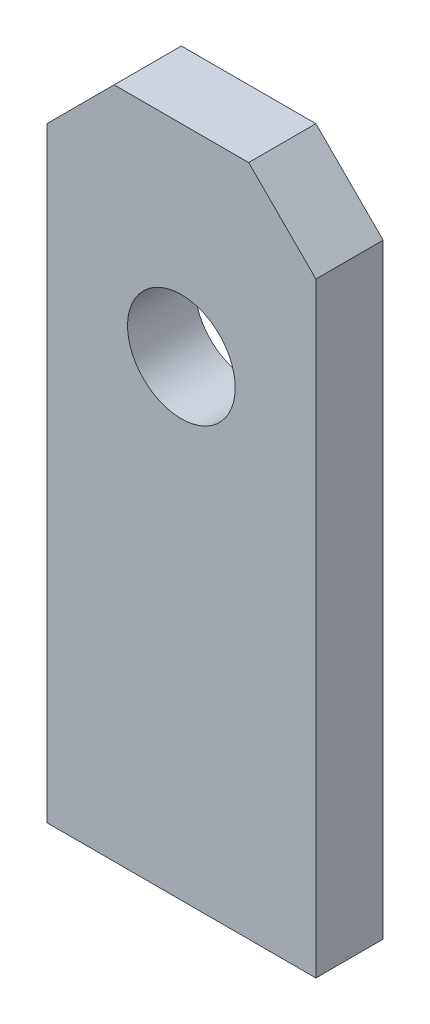
ISO-10303-21;
HEADER;
FILE_DESCRIPTION(('STEP AP214'),'2;1');
FILE_NAME('part.step','',(''),(''),'','','');
FILE_SCHEMA(('AUTOMOTIVE_DESIGN { 1 0 10303 214 1 1 1 1 }'));
ENDSEC;
DATA;
#1=APPLICATION_CONTEXT('core data for automotive mechanical design processes');
#2=APPLICATION_PROTOCOL_DEFINITION('international standard','automotive_design',2000,#1);
#3=PRODUCT_CONTEXT('',#1,'mechanical');
#4=PRODUCT('Part','Part','',(#3));
#5=PRODUCT_RELATED_PRODUCT_CATEGORY('part','',(#4));
#6=PRODUCT_DEFINITION_FORMATION('','',#4);
#7=PRODUCT_DEFINITION_CONTEXT('part definition',#1,'design');
#8=PRODUCT_DEFINITION('design','',#6,#7);
#9=PRODUCT_DEFINITION_SHAPE('','',#8);
#10=(LENGTH_UNIT() NAMED_UNIT(*) SI_UNIT(.MILLI.,.METRE.));
#11=(NAMED_UNIT(*) PLANE_ANGLE_UNIT() SI_UNIT($,.RADIAN.));
#12=(NAMED_UNIT(*) SI_UNIT($,.STERADIAN.) SOLID_ANGLE_UNIT());
#13=UNCERTAINTY_MEASURE_WITH_UNIT(LENGTH_MEASURE(1.E-05),#10,'distance_accuracy_value','');
#14=(GEOMETRIC_REPRESENTATION_CONTEXT(3) GLOBAL_UNCERTAINTY_ASSIGNED_CONTEXT((#13)) GLOBAL_UNIT_ASSIGNED_CONTEXT((#10,
#11,#12)) REPRESENTATION_CONTEXT('',''));
#15=CARTESIAN_POINT('',(0.,0.,0.));
#16=DIRECTION('',(0.,0.,1.));
#17=DIRECTION('',(1.,0.,0.));
#18=AXIS2_PLACEMENT_3D('',#15,#16,#17);
#19=CARTESIAN_POINT('',(0.,0.,5.00000000000001));
#20=DIRECTION('',(0.,0.,1.));
#21=DIRECTION('',(1.,0.,0.));
#22=AXIS2_PLACEMENT_3D('',#19,#20,#21);
#23=PLANE('',#22);
#24=DIRECTION('',(0.,-1.,0.));
#25=VECTOR('',#24,1.);
#26=CARTESIAN_POINT('',(-20.,40.0000000000001,5.00000000000001));
#27=LINE('',#26,#25);
#28=CARTESIAN_POINT('',(-20.,40.0000000000001,5.00000000000001));
#29=VERTEX_POINT('',#28);
#30=CARTESIAN_POINT('',(-20.,-50.,5.00000000000001));
#31=VERTEX_POINT('',#30);
#32=EDGE_CURVE('E126',#29,#31,#27,.T.);
#33=ORIENTED_EDGE('',*,*,#32,.T.);
#34=DIRECTION('',(1.,0.,0.));
#35=VECTOR('',#34,1.);
#36=CARTESIAN_POINT('',(-20.,-50.,5.00000000000001));
#37=LINE('',#36,#35);
#38=CARTESIAN_POINT('',(20.,-50.,5.00000000000001));
#39=VERTEX_POINT('',#38);
#40=EDGE_CURVE('E84',#31,#39,#37,.T.);
#41=ORIENTED_EDGE('',*,*,#40,.T.);
#42=DIRECTION('',(0.,1.,0.));
#43=VECTOR('',#42,1.);
#44=CARTESIAN_POINT('',(20.,-50.,5.00000000000001));
#45=LINE('',#44,#43);
#46=CARTESIAN_POINT('',(20.,40.0000000000001,5.00000000000001));
#47=VERTEX_POINT('',#46);
#48=EDGE_CURVE('E97',#39,#47,#45,.T.);
#49=ORIENTED_EDGE('',*,*,#48,.T.);
#50=DIRECTION('',(-0.70710678118655,0.707106781186546,0.));
#51=VECTOR('',#50,1.);
#52=CARTESIAN_POINT('',(20.,40.0000000000001,5.00000000000001));
#53=LINE('',#52,#51);
#54=CARTESIAN_POINT('',(10.,50.,5.00000000000001));
#55=VERTEX_POINT('',#54);
#56=EDGE_CURVE('E91',#47,#55,#53,.T.);
#57=ORIENTED_EDGE('',*,*,#56,.T.);
#58=DIRECTION('',(-1.,0.,0.));
#59=VECTOR('',#58,1.);
#60=CARTESIAN_POINT('',(10.,50.,5.00000000000001));
#61=LINE('',#60,#59);
#62=CARTESIAN_POINT('',(-10.,50.,5.00000000000001));
#63=VERTEX_POINT('',#62);
#64=EDGE_CURVE('E95',#55,#63,#61,.T.);
#65=ORIENTED_EDGE('',*,*,#64,.T.);
#66=DIRECTION('',(-0.707106781186549,-0.707106781186546,0.));
#67=VECTOR('',#66,1.);
#68=CARTESIAN_POINT('',(-10.,50.,5.00000000000001));
#69=LINE('',#68,#67);
#70=EDGE_CURVE('E47',#63,#29,#69,.T.);
#71=ORIENTED_EDGE('',*,*,#70,.T.);
#72=EDGE_LOOP('',(#33,#41,#49,#57,#65,#71));
#73=FACE_BOUND('',#72,.T.);
#74=CARTESIAN_POINT('',(0.,20.,5.00000000000001));
#75=DIRECTION('',(0.,0.,1.));
#76=DIRECTION('',(1.,0.,0.));
#77=AXIS2_PLACEMENT_3D('',#74,#75,#76);
#78=CIRCLE('',#77,8.);
#79=CARTESIAN_POINT('',(8.00000000000001,20.,5.00000000000001));
#80=VERTEX_POINT('',#79);
#81=EDGE_CURVE('E119',#80,#80,#78,.T.);
#82=ORIENTED_EDGE('',*,*,#81,.F.);
#83=EDGE_LOOP('',(#82));
#84=FACE_BOUND('',#83,.T.);
#85=ADVANCED_FACE('F30',(#73,#84),#23,.T.);
#86=CARTESIAN_POINT('',(0.,0.,-5.00000000000001));
#87=DIRECTION('',(0.,0.,1.));
#88=DIRECTION('',(1.,0.,0.));
#89=AXIS2_PLACEMENT_3D('',#86,#87,#88);
#90=PLANE('',#89);
#91=DIRECTION('',(0.,-1.,0.));
#92=VECTOR('',#91,1.);
#93=CARTESIAN_POINT('',(-20.,40.0000000000001,-5.00000000000001));
#94=LINE('',#93,#92);
#95=CARTESIAN_POINT('',(-20.,40.0000000000001,-5.00000000000001));
#96=VERTEX_POINT('',#95);
#97=CARTESIAN_POINT('',(-20.,-50.,-5.00000000000001));
#98=VERTEX_POINT('',#97);
#99=EDGE_CURVE('E115',#96,#98,#94,.T.);
#100=ORIENTED_EDGE('',*,*,#99,.F.);
#101=DIRECTION('',(-0.707106781186549,-0.707106781186546,0.));
#102=VECTOR('',#101,1.);
#103=CARTESIAN_POINT('',(-10.,50.,-5.00000000000001));
#104=LINE('',#103,#102);
#105=CARTESIAN_POINT('',(-10.,50.,-5.00000000000001));
#106=VERTEX_POINT('',#105);
#107=EDGE_CURVE('E76',#106,#96,#104,.T.);
#108=ORIENTED_EDGE('',*,*,#107,.F.);
#109=DIRECTION('',(-1.,0.,0.));
#110=VECTOR('',#109,1.);
#111=CARTESIAN_POINT('',(10.,50.,-5.00000000000001));
#112=LINE('',#111,#110);
#113=CARTESIAN_POINT('',(10.,50.,-5.00000000000001));
#114=VERTEX_POINT('',#113);
#115=EDGE_CURVE('E70',#114,#106,#112,.T.);
#116=ORIENTED_EDGE('',*,*,#115,.F.);
#117=DIRECTION('',(-0.70710678118655,0.707106781186546,0.));
#118=VECTOR('',#117,1.);
#119=CARTESIAN_POINT('',(20.,40.0000000000001,-5.00000000000001));
#120=LINE('',#119,#118);
#121=CARTESIAN_POINT('',(20.,40.0000000000001,-5.00000000000001));
#122=VERTEX_POINT('',#121);
#123=EDGE_CURVE('E105',#122,#114,#120,.T.);
#124=ORIENTED_EDGE('',*,*,#123,.F.);
#125=DIRECTION('',(0.,1.,0.));
#126=VECTOR('',#125,1.);
#127=CARTESIAN_POINT('',(20.,-50.,-5.00000000000001));
#128=LINE('',#127,#126);
#129=CARTESIAN_POINT('',(20.,-50.,-5.00000000000001));
#130=VERTEX_POINT('',#129);
#131=EDGE_CURVE('E121',#130,#122,#128,.T.);
#132=ORIENTED_EDGE('',*,*,#131,.F.);
#133=DIRECTION('',(1.,0.,0.));
#134=VECTOR('',#133,1.);
#135=CARTESIAN_POINT('',(-20.,-50.,-5.00000000000001));
#136=LINE('',#135,#134);
#137=EDGE_CURVE('E118',#98,#130,#136,.T.);
#138=ORIENTED_EDGE('',*,*,#137,.F.);
#139=EDGE_LOOP('',(#100,#108,#116,#124,#132,#138));
#140=FACE_BOUND('',#139,.T.);
#141=CARTESIAN_POINT('',(0.,20.,-5.00000000000001));
#142=DIRECTION('',(0.,0.,1.));
#143=DIRECTION('',(1.,0.,0.));
#144=AXIS2_PLACEMENT_3D('',#141,#142,#143);
#145=CIRCLE('',#144,8.);
#146=CARTESIAN_POINT('',(8.00000000000001,20.,-5.00000000000001));
#147=VERTEX_POINT('',#146);
#148=EDGE_CURVE('E201',#147,#147,#145,.T.);
#149=ORIENTED_EDGE('',*,*,#148,.T.);
#150=EDGE_LOOP('',(#149));
#151=FACE_BOUND('',#150,.T.);
#152=ADVANCED_FACE('F135',(#140,#151),#90,.F.);
#153=CARTESIAN_POINT('',(-20.,40.0000000000001,5.00000000000001));
#154=DIRECTION('',(1.,0.,0.));
#155=DIRECTION('',(0.,1.,0.));
#156=AXIS2_PLACEMENT_3D('',#153,#154,#155);
#157=PLANE('',#156);
#158=ORIENTED_EDGE('',*,*,#99,.T.);
#159=DIRECTION('',(0.,0.,-1.));
#160=VECTOR('',#159,1.);
#161=CARTESIAN_POINT('',(-20.,-50.,5.00000000000001));
#162=LINE('',#161,#160);
#163=EDGE_CURVE('E11',#31,#98,#162,.T.);
#164=ORIENTED_EDGE('',*,*,#163,.F.);
#165=ORIENTED_EDGE('',*,*,#32,.F.);
#166=DIRECTION('',(0.,0.,-1.));
#167=VECTOR('',#166,1.);
#168=CARTESIAN_POINT('',(-20.,40.0000000000001,5.00000000000001));
#169=LINE('',#168,#167);
#170=EDGE_CURVE('E111',#29,#96,#169,.T.);
#171=ORIENTED_EDGE('',*,*,#170,.T.);
#172=EDGE_LOOP('',(#158,#164,#165,#171));
#173=FACE_BOUND('',#172,.T.);
#174=ADVANCED_FACE('F32',(#173),#157,.F.);
#175=CARTESIAN_POINT('',(-20.,-50.,5.00000000000001));
#176=DIRECTION('',(0.,1.,0.));
#177=DIRECTION('',(0.,0.,1.));
#178=AXIS2_PLACEMENT_3D('',#175,#176,#177);
#179=PLANE('',#178);
#180=ORIENTED_EDGE('',*,*,#137,.T.);
#181=DIRECTION('',(0.,0.,-1.));
#182=VECTOR('',#181,1.);
#183=CARTESIAN_POINT('',(20.,-50.,5.00000000000001));
#184=LINE('',#183,#182);
#185=EDGE_CURVE('E39',#39,#130,#184,.T.);
#186=ORIENTED_EDGE('',*,*,#185,.F.);
#187=ORIENTED_EDGE('',*,*,#40,.F.);
#188=ORIENTED_EDGE('',*,*,#163,.T.);
#189=EDGE_LOOP('',(#180,#186,#187,#188));
#190=FACE_BOUND('',#189,.T.);
#191=ADVANCED_FACE('F160',(#190),#179,.F.);
#192=CARTESIAN_POINT('',(20.,-50.,5.00000000000001));
#193=DIRECTION('',(-1.,0.,0.));
#194=DIRECTION('',(0.,-1.,0.));
#195=AXIS2_PLACEMENT_3D('',#192,#193,#194);
#196=PLANE('',#195);
#197=ORIENTED_EDGE('',*,*,#131,.T.);
#198=DIRECTION('',(0.,0.,-1.));
#199=VECTOR('',#198,1.);
#200=CARTESIAN_POINT('',(20.,40.0000000000001,5.00000000000001));
#201=LINE('',#200,#199);
#202=EDGE_CURVE('E106',#47,#122,#201,.T.);
#203=ORIENTED_EDGE('',*,*,#202,.F.);
#204=ORIENTED_EDGE('',*,*,#48,.F.);
#205=ORIENTED_EDGE('',*,*,#185,.T.);
#206=EDGE_LOOP('',(#197,#203,#204,#205));
#207=FACE_BOUND('',#206,.T.);
#208=ADVANCED_FACE('F132',(#207),#196,.F.);
#209=CARTESIAN_POINT('',(20.,40.0000000000001,5.00000000000001));
#210=DIRECTION('',(-0.707106781186546,-0.707106781186549,0.));
#211=DIRECTION('',(0.70710678118655,-0.707106781186546,0.));
#212=AXIS2_PLACEMENT_3D('',#209,#210,#211);
#213=PLANE('',#212);
#214=ORIENTED_EDGE('',*,*,#123,.T.);
#215=DIRECTION('',(0.,0.,-1.));
#216=VECTOR('',#215,1.);
#217=CARTESIAN_POINT('',(10.,50.,5.00000000000001));
#218=LINE('',#217,#216);
#219=EDGE_CURVE('E102',#55,#114,#218,.T.);
#220=ORIENTED_EDGE('',*,*,#219,.F.);
#221=ORIENTED_EDGE('',*,*,#56,.F.);
#222=ORIENTED_EDGE('',*,*,#202,.T.);
#223=EDGE_LOOP('',(#214,#220,#221,#222));
#224=FACE_BOUND('',#223,.T.);
#225=ADVANCED_FACE('F103',(#224),#213,.F.);
#226=CARTESIAN_POINT('',(10.,50.,5.00000000000001));
#227=DIRECTION('',(0.,-1.,0.));
#228=DIRECTION('',(0.,0.,-1.));
#229=AXIS2_PLACEMENT_3D('',#226,#227,#228);
#230=PLANE('',#229);
#231=ORIENTED_EDGE('',*,*,#115,.T.);
#232=DIRECTION('',(0.,0.,-1.));
#233=VECTOR('',#232,1.);
#234=CARTESIAN_POINT('',(-10.,50.,5.00000000000001));
#235=LINE('',#234,#233);
#236=EDGE_CURVE('E107',#63,#106,#235,.T.);
#237=ORIENTED_EDGE('',*,*,#236,.F.);
#238=ORIENTED_EDGE('',*,*,#64,.F.);
#239=ORIENTED_EDGE('',*,*,#219,.T.);
#240=EDGE_LOOP('',(#231,#237,#238,#239));
#241=FACE_BOUND('',#240,.T.);
#242=ADVANCED_FACE('F109',(#241),#230,.F.);
#243=CARTESIAN_POINT('',(-10.,50.,5.00000000000001));
#244=DIRECTION('',(0.707106781186547,-0.707106781186549,0.));
#245=DIRECTION('',(0.707106781186549,0.707106781186546,0.));
#246=AXIS2_PLACEMENT_3D('',#243,#244,#245);
#247=PLANE('',#246);
#248=ORIENTED_EDGE('',*,*,#107,.T.);
#249=ORIENTED_EDGE('',*,*,#170,.F.);
#250=ORIENTED_EDGE('',*,*,#70,.F.);
#251=ORIENTED_EDGE('',*,*,#236,.T.);
#252=EDGE_LOOP('',(#248,#249,#250,#251));
#253=FACE_BOUND('',#252,.T.);
#254=ADVANCED_FACE('F140',(#253),#247,.F.);
#255=CARTESIAN_POINT('',(0.,20.,5.00000000000001));
#256=DIRECTION('',(0.,0.,-1.));
#257=DIRECTION('',(-1.,0.,0.));
#258=AXIS2_PLACEMENT_3D('',#255,#256,#257);
#259=CYLINDRICAL_SURFACE('',#258,8.);
#260=ORIENTED_EDGE('',*,*,#81,.T.);
#261=EDGE_LOOP('',(#260));
#262=FACE_BOUND('',#261,.T.);
#263=ORIENTED_EDGE('',*,*,#148,.F.);
#264=EDGE_LOOP('',(#263));
#265=FACE_BOUND('',#264,.T.);
#266=ADVANCED_FACE('F142',(#262,#265),#259,.F.);
#267=CLOSED_SHELL('',(#85,#152,#174,#191,#208,#225,#242,#254,#266));
#268=MANIFOLD_SOLID_BREP('B2',#267);
#269=ADVANCED_BREP_SHAPE_REPRESENTATION('',(#18,#268),#14);
#270=SHAPE_DEFINITION_REPRESENTATION(#9,#269);
ENDSEC;
END-ISO-10303-21;
